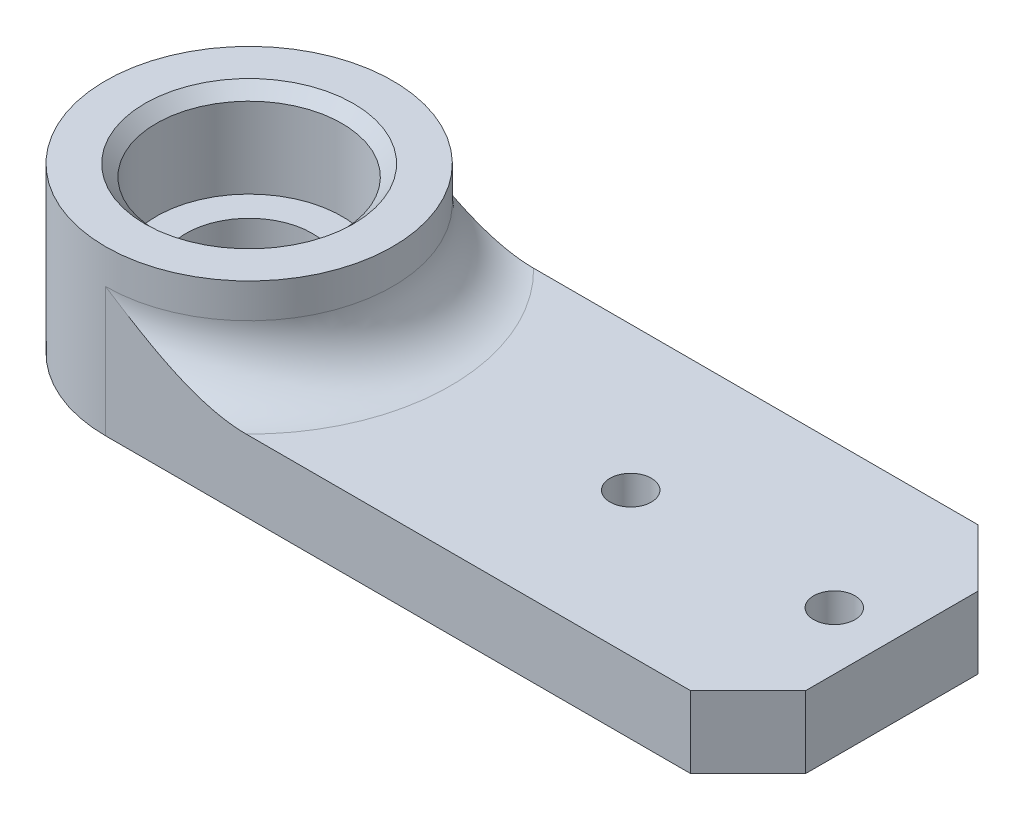
ISO-10303-21;
HEADER;
FILE_DESCRIPTION(('STEP AP214'),'2;1');
FILE_NAME('part.step','',(''),(''),'','','');
FILE_SCHEMA(('AUTOMOTIVE_DESIGN { 1 0 10303 214 1 1 1 1 }'));
ENDSEC;
DATA;
#1=APPLICATION_CONTEXT('core data for automotive mechanical design processes');
#2=APPLICATION_PROTOCOL_DEFINITION('international standard','automotive_design',2000,#1);
#3=PRODUCT_CONTEXT('',#1,'mechanical');
#4=PRODUCT('Part','Part','',(#3));
#5=PRODUCT_RELATED_PRODUCT_CATEGORY('part','',(#4));
#6=PRODUCT_DEFINITION_FORMATION('','',#4);
#7=PRODUCT_DEFINITION_CONTEXT('part definition',#1,'design');
#8=PRODUCT_DEFINITION('design','',#6,#7);
#9=PRODUCT_DEFINITION_SHAPE('','',#8);
#10=(LENGTH_UNIT() NAMED_UNIT(*) SI_UNIT(.MILLI.,.METRE.));
#11=(NAMED_UNIT(*) PLANE_ANGLE_UNIT() SI_UNIT($,.RADIAN.));
#12=(NAMED_UNIT(*) SI_UNIT($,.STERADIAN.) SOLID_ANGLE_UNIT());
#13=UNCERTAINTY_MEASURE_WITH_UNIT(LENGTH_MEASURE(1.E-05),#10,'distance_accuracy_value','');
#14=(GEOMETRIC_REPRESENTATION_CONTEXT(3) GLOBAL_UNCERTAINTY_ASSIGNED_CONTEXT((#13)) GLOBAL_UNIT_ASSIGNED_CONTEXT((#10,
#11,#12)) REPRESENTATION_CONTEXT('',''));
#15=CARTESIAN_POINT('',(0.,0.,0.));
#16=DIRECTION('',(0.,0.,1.));
#17=DIRECTION('',(1.,0.,0.));
#18=AXIS2_PLACEMENT_3D('',#15,#16,#17);
#19=CARTESIAN_POINT('',(0.,4.064,0.));
#20=DIRECTION('',(0.,-1.,0.));
#21=DIRECTION('',(0.,0.,-1.));
#22=AXIS2_PLACEMENT_3D('',#19,#20,#21);
#23=CYLINDRICAL_SURFACE('',#22,6.35);
#24=CARTESIAN_POINT('',(0.,4.064,0.));
#25=DIRECTION('',(0.,1.,0.));
#26=DIRECTION('',(0.,0.,1.));
#27=AXIS2_PLACEMENT_3D('',#24,#25,#26);
#28=CIRCLE('',#27,6.35);
#29=CARTESIAN_POINT('',(0.,4.064,6.35));
#30=VERTEX_POINT('',#29);
#31=EDGE_CURVE('E145',#30,#30,#28,.T.);
#32=ORIENTED_EDGE('',*,*,#31,.F.);
#33=EDGE_LOOP('',(#32));
#34=FACE_BOUND('',#33,.T.);
#35=DIRECTION('',(0.,-1.,0.));
#36=VECTOR('',#35,1.);
#37=CARTESIAN_POINT('',(0.,0.,6.35));
#38=LINE('',#37,#36);
#39=CARTESIAN_POINT('',(0.,2.54,6.35));
#40=VERTEX_POINT('',#39);
#41=CARTESIAN_POINT('',(0.,-3.175,6.35));
#42=VERTEX_POINT('',#41);
#43=EDGE_CURVE('E130',#40,#42,#38,.T.);
#44=ORIENTED_EDGE('',*,*,#43,.F.);
#45=CARTESIAN_POINT('',(0.,2.54,0.));
#46=DIRECTION('',(0.,1.,0.));
#47=DIRECTION('',(0.,0.,1.));
#48=AXIS2_PLACEMENT_3D('',#45,#46,#47);
#49=CIRCLE('',#48,6.35);
#50=CARTESIAN_POINT('',(0.,2.54,-6.35));
#51=VERTEX_POINT('',#50);
#52=EDGE_CURVE('E127',#40,#51,#49,.T.);
#53=ORIENTED_EDGE('',*,*,#52,.T.);
#54=DIRECTION('',(0.,-1.,0.));
#55=VECTOR('',#54,1.);
#56=CARTESIAN_POINT('',(0.,0.,-6.35));
#57=LINE('',#56,#55);
#58=CARTESIAN_POINT('',(0.,-3.175,-6.35));
#59=VERTEX_POINT('',#58);
#60=EDGE_CURVE('E114',#51,#59,#57,.T.);
#61=ORIENTED_EDGE('',*,*,#60,.T.);
#62=CARTESIAN_POINT('',(0.,-3.175,0.));
#63=DIRECTION('',(0.,-1.,0.));
#64=DIRECTION('',(0.,0.,-1.));
#65=AXIS2_PLACEMENT_3D('',#62,#63,#64);
#66=CIRCLE('',#65,6.35);
#67=EDGE_CURVE('E125',#42,#59,#66,.T.);
#68=ORIENTED_EDGE('',*,*,#67,.F.);
#69=EDGE_LOOP('',(#44,#53,#61,#68));
#70=FACE_BOUND('',#69,.T.);
#71=ADVANCED_FACE('F47',(#34,#70),#23,.T.);
#72=CARTESIAN_POINT('',(0.,4.064,0.));
#73=DIRECTION('',(0.,1.,0.));
#74=DIRECTION('',(0.,0.,1.));
#75=AXIS2_PLACEMENT_3D('',#72,#73,#74);
#76=PLANE('',#75);
#77=CARTESIAN_POINT('',(0.,4.064,0.));
#78=DIRECTION('',(0.,1.,0.));
#79=DIRECTION('',(0.,0.,1.));
#80=AXIS2_PLACEMENT_3D('',#77,#78,#79);
#81=CIRCLE('',#80,4.6101);
#82=CARTESIAN_POINT('',(0.,4.064,4.6101));
#83=VERTEX_POINT('',#82);
#84=EDGE_CURVE('E309',#83,#83,#81,.F.);
#85=ORIENTED_EDGE('',*,*,#84,.T.);
#86=EDGE_LOOP('',(#85));
#87=FACE_BOUND('',#86,.T.);
#88=ORIENTED_EDGE('',*,*,#31,.T.);
#89=EDGE_LOOP('',(#88));
#90=FACE_BOUND('',#89,.T.);
#91=ADVANCED_FACE('F210',(#87,#90),#76,.T.);
#92=CARTESIAN_POINT('',(0.,4.064,0.));
#93=DIRECTION('',(0.,-1.,0.));
#94=DIRECTION('',(0.,0.,-1.));
#95=AXIS2_PLACEMENT_3D('',#92,#93,#94);
#96=CYLINDRICAL_SURFACE('',#95,4.1021);
#97=CARTESIAN_POINT('',(0.,3.556,0.));
#98=DIRECTION('',(0.,1.,0.));
#99=DIRECTION('',(0.,0.,1.));
#100=AXIS2_PLACEMENT_3D('',#97,#98,#99);
#101=CIRCLE('',#100,4.1021);
#102=CARTESIAN_POINT('',(0.,3.556,4.1021));
#103=VERTEX_POINT('',#102);
#104=EDGE_CURVE('E321',#103,#103,#101,.T.);
#105=ORIENTED_EDGE('',*,*,#104,.T.);
#106=EDGE_LOOP('',(#105));
#107=FACE_BOUND('',#106,.T.);
#108=CARTESIAN_POINT('',(0.,0.,0.));
#109=DIRECTION('',(0.,1.,0.));
#110=DIRECTION('',(0.,0.,1.));
#111=AXIS2_PLACEMENT_3D('',#108,#109,#110);
#112=CIRCLE('',#111,4.1021);
#113=CARTESIAN_POINT('',(0.,0.,4.1021));
#114=VERTEX_POINT('',#113);
#115=EDGE_CURVE('E139',#114,#114,#112,.T.);
#116=ORIENTED_EDGE('',*,*,#115,.F.);
#117=EDGE_LOOP('',(#116));
#118=FACE_BOUND('',#117,.T.);
#119=ADVANCED_FACE('F216',(#107,#118),#96,.F.);
#120=CARTESIAN_POINT('',(0.,0.,0.));
#121=DIRECTION('',(0.,-1.,0.));
#122=DIRECTION('',(0.,0.,-1.));
#123=AXIS2_PLACEMENT_3D('',#120,#121,#122);
#124=PLANE('',#123);
#125=CARTESIAN_POINT('',(0.,0.,0.));
#126=DIRECTION('',(0.,-1.,0.));
#127=DIRECTION('',(0.,0.,-1.));
#128=AXIS2_PLACEMENT_3D('',#125,#126,#127);
#129=CIRCLE('',#128,2.794);
#130=CARTESIAN_POINT('',(0.,0.,-2.794));
#131=VERTEX_POINT('',#130);
#132=EDGE_CURVE('E148',#131,#131,#129,.T.);
#133=ORIENTED_EDGE('',*,*,#132,.T.);
#134=EDGE_LOOP('',(#133));
#135=FACE_BOUND('',#134,.T.);
#136=ORIENTED_EDGE('',*,*,#115,.T.);
#137=EDGE_LOOP('',(#136));
#138=FACE_BOUND('',#137,.T.);
#139=ADVANCED_FACE('F223',(#135,#138),#124,.F.);
#140=CARTESIAN_POINT('',(0.,-3.175,0.));
#141=DIRECTION('',(0.,-1.,0.));
#142=DIRECTION('',(0.,0.,-1.));
#143=AXIS2_PLACEMENT_3D('',#140,#141,#142);
#144=PLANE('',#143);
#145=DIRECTION('',(0.,0.,-1.));
#146=VECTOR('',#145,1.);
#147=CARTESIAN_POINT('',(28.40228,-3.175,-6.35));
#148=LINE('',#147,#146);
#149=CARTESIAN_POINT('',(28.40228,-3.175,3.81));
#150=VERTEX_POINT('',#149);
#151=CARTESIAN_POINT('',(28.40228,-3.175,-3.80999999999999));
#152=VERTEX_POINT('',#151);
#153=EDGE_CURVE('E121',#150,#152,#148,.T.);
#154=ORIENTED_EDGE('',*,*,#153,.F.);
#155=DIRECTION('',(0.707106781186549,0.,-0.707106781186546));
#156=VECTOR('',#155,1.);
#157=CARTESIAN_POINT('',(16.1061399999999,-3.175,16.10614));
#158=LINE('',#157,#156);
#159=CARTESIAN_POINT('',(25.86228,-3.175,6.35));
#160=VERTEX_POINT('',#159);
#161=EDGE_CURVE('E302',#150,#160,#158,.F.);
#162=ORIENTED_EDGE('',*,*,#161,.T.);
#163=DIRECTION('',(1.,0.,0.));
#164=VECTOR('',#163,1.);
#165=CARTESIAN_POINT('',(28.40228,-3.175,6.35));
#166=LINE('',#165,#164);
#167=EDGE_CURVE('E137',#42,#160,#166,.T.);
#168=ORIENTED_EDGE('',*,*,#167,.F.);
#169=ORIENTED_EDGE('',*,*,#67,.T.);
#170=DIRECTION('',(-1.,0.,0.));
#171=VECTOR('',#170,1.);
#172=CARTESIAN_POINT('',(0.,-3.175,-6.35));
#173=LINE('',#172,#171);
#174=CARTESIAN_POINT('',(25.86228,-3.175,-6.35));
#175=VERTEX_POINT('',#174);
#176=EDGE_CURVE('E110',#175,#59,#173,.T.);
#177=ORIENTED_EDGE('',*,*,#176,.F.);
#178=DIRECTION('',(-0.707106781186546,0.,-0.707106781186549));
#179=VECTOR('',#178,1.);
#180=CARTESIAN_POINT('',(16.10614,-3.175,-16.10614));
#181=LINE('',#180,#179);
#182=EDGE_CURVE('E304',#175,#152,#181,.F.);
#183=ORIENTED_EDGE('',*,*,#182,.T.);
#184=EDGE_LOOP('',(#154,#162,#168,#169,#177,#183));
#185=FACE_BOUND('',#184,.T.);
#186=CARTESIAN_POINT('',(0.,-3.175,0.));
#187=DIRECTION('',(0.,-1.,0.));
#188=DIRECTION('',(0.,0.,-1.));
#189=AXIS2_PLACEMENT_3D('',#186,#187,#188);
#190=CIRCLE('',#189,2.794);
#191=CARTESIAN_POINT('',(0.,-3.175,-2.794));
#192=VERTEX_POINT('',#191);
#193=EDGE_CURVE('E140',#192,#192,#190,.T.);
#194=ORIENTED_EDGE('',*,*,#193,.F.);
#195=EDGE_LOOP('',(#194));
#196=FACE_BOUND('',#195,.T.);
#197=CARTESIAN_POINT('',(25.86228,-3.175,0.));
#198=DIRECTION('',(0.,1.,0.));
#199=DIRECTION('',(0.,0.,1.));
#200=AXIS2_PLACEMENT_3D('',#197,#198,#199);
#201=CIRCLE('',#200,0.914399999999999);
#202=CARTESIAN_POINT('',(25.86228,-3.175,0.914399999999999));
#203=VERTEX_POINT('',#202);
#204=EDGE_CURVE('E263',#203,#203,#201,.T.);
#205=ORIENTED_EDGE('',*,*,#204,.T.);
#206=EDGE_LOOP('',(#205));
#207=FACE_BOUND('',#206,.T.);
#208=CARTESIAN_POINT('',(16.86306,-3.175,0.));
#209=DIRECTION('',(0.,1.,0.));
#210=DIRECTION('',(0.,0.,1.));
#211=AXIS2_PLACEMENT_3D('',#208,#209,#210);
#212=CIRCLE('',#211,0.914399999999999);
#213=CARTESIAN_POINT('',(16.86306,-3.175,0.914399999999999));
#214=VERTEX_POINT('',#213);
#215=EDGE_CURVE('E271',#214,#214,#212,.T.);
#216=ORIENTED_EDGE('',*,*,#215,.T.);
#217=EDGE_LOOP('',(#216));
#218=FACE_BOUND('',#217,.T.);
#219=ADVANCED_FACE('F135',(#185,#196,#207,#218),#144,.T.);
#220=CARTESIAN_POINT('',(0.,-3.175,0.));
#221=DIRECTION('',(0.,1.,0.));
#222=DIRECTION('',(0.,0.,1.));
#223=AXIS2_PLACEMENT_3D('',#220,#221,#222);
#224=CYLINDRICAL_SURFACE('',#223,2.794);
#225=ORIENTED_EDGE('',*,*,#193,.T.);
#226=EDGE_LOOP('',(#225));
#227=FACE_BOUND('',#226,.T.);
#228=ORIENTED_EDGE('',*,*,#132,.F.);
#229=EDGE_LOOP('',(#228));
#230=FACE_BOUND('',#229,.T.);
#231=ADVANCED_FACE('F232',(#227,#230),#224,.F.);
#232=CARTESIAN_POINT('',(0.,0.,0.));
#233=DIRECTION('',(0.,1.,0.));
#234=DIRECTION('',(0.,0.,1.));
#235=AXIS2_PLACEMENT_3D('',#232,#233,#234);
#236=PLANE('',#235);
#237=CARTESIAN_POINT('',(25.86228,0.,0.));
#238=DIRECTION('',(0.,1.,0.));
#239=DIRECTION('',(0.,0.,1.));
#240=AXIS2_PLACEMENT_3D('',#237,#238,#239);
#241=CIRCLE('',#240,0.914399999999999);
#242=CARTESIAN_POINT('',(25.86228,0.,0.914399999999999));
#243=VERTEX_POINT('',#242);
#244=EDGE_CURVE('E255',#243,#243,#241,.T.);
#245=ORIENTED_EDGE('',*,*,#244,.F.);
#246=EDGE_LOOP('',(#245));
#247=FACE_BOUND('',#246,.T.);
#248=DIRECTION('',(1.,0.,0.));
#249=VECTOR('',#248,1.);
#250=CARTESIAN_POINT('',(28.40228,0.,6.35));
#251=LINE('',#250,#249);
#252=CARTESIAN_POINT('',(6.22170394666928,0.,6.35));
#253=VERTEX_POINT('',#252);
#254=CARTESIAN_POINT('',(25.86228,0.,6.35));
#255=VERTEX_POINT('',#254);
#256=EDGE_CURVE('E120',#253,#255,#251,.T.);
#257=ORIENTED_EDGE('',*,*,#256,.T.);
#258=DIRECTION('',(-0.707106781186549,0.,0.707106781186546));
#259=VECTOR('',#258,1.);
#260=CARTESIAN_POINT('',(16.1061399999999,0.,16.10614));
#261=LINE('',#260,#259);
#262=CARTESIAN_POINT('',(28.40228,0.,3.81));
#263=VERTEX_POINT('',#262);
#264=EDGE_CURVE('E57',#255,#263,#261,.F.);
#265=ORIENTED_EDGE('',*,*,#264,.T.);
#266=DIRECTION('',(0.,0.,-1.));
#267=VECTOR('',#266,1.);
#268=CARTESIAN_POINT('',(28.40228,0.,-6.35));
#269=LINE('',#268,#267);
#270=CARTESIAN_POINT('',(28.40228,0.,-3.80999999999999));
#271=VERTEX_POINT('',#270);
#272=EDGE_CURVE('E258',#263,#271,#269,.T.);
#273=ORIENTED_EDGE('',*,*,#272,.T.);
#274=DIRECTION('',(0.707106781186546,0.,0.707106781186549));
#275=VECTOR('',#274,1.);
#276=CARTESIAN_POINT('',(16.10614,0.,-16.10614));
#277=LINE('',#276,#275);
#278=CARTESIAN_POINT('',(25.86228,0.,-6.35));
#279=VERTEX_POINT('',#278);
#280=EDGE_CURVE('E64',#271,#279,#277,.F.);
#281=ORIENTED_EDGE('',*,*,#280,.T.);
#282=DIRECTION('',(-1.,0.,0.));
#283=VECTOR('',#282,1.);
#284=CARTESIAN_POINT('',(0.,0.,-6.35));
#285=LINE('',#284,#283);
#286=CARTESIAN_POINT('',(6.22170394666927,0.,-6.35));
#287=VERTEX_POINT('',#286);
#288=EDGE_CURVE('E131',#279,#287,#285,.T.);
#289=ORIENTED_EDGE('',*,*,#288,.T.);
#290=CARTESIAN_POINT('',(0.,0.,0.));
#291=DIRECTION('',(0.,1.,0.));
#292=DIRECTION('',(0.,0.,1.));
#293=AXIS2_PLACEMENT_3D('',#290,#291,#292);
#294=CIRCLE('',#293,8.89);
#295=EDGE_CURVE('E155',#287,#253,#294,.F.);
#296=ORIENTED_EDGE('',*,*,#295,.T.);
#297=EDGE_LOOP('',(#257,#265,#273,#281,#289,#296));
#298=FACE_BOUND('',#297,.T.);
#299=CARTESIAN_POINT('',(16.86306,0.,0.));
#300=DIRECTION('',(0.,1.,0.));
#301=DIRECTION('',(0.,0.,1.));
#302=AXIS2_PLACEMENT_3D('',#299,#300,#301);
#303=CIRCLE('',#302,0.914399999999999);
#304=CARTESIAN_POINT('',(16.86306,0.,0.914399999999999));
#305=VERTEX_POINT('',#304);
#306=EDGE_CURVE('E267',#305,#305,#303,.T.);
#307=ORIENTED_EDGE('',*,*,#306,.F.);
#308=EDGE_LOOP('',(#307));
#309=FACE_BOUND('',#308,.T.);
#310=ADVANCED_FACE('F234',(#247,#298,#309),#236,.T.);
#311=CARTESIAN_POINT('',(28.40228,0.,6.35));
#312=DIRECTION('',(0.,0.,-1.));
#313=DIRECTION('',(-1.,0.,0.));
#314=AXIS2_PLACEMENT_3D('',#311,#312,#313);
#315=PLANE('',#314);
#316=ORIENTED_EDGE('',*,*,#167,.T.);
#317=DIRECTION('',(0.,1.,0.));
#318=VECTOR('',#317,1.);
#319=CARTESIAN_POINT('',(25.86228,0.,6.35));
#320=LINE('',#319,#318);
#321=EDGE_CURVE('E72',#160,#255,#320,.T.);
#322=ORIENTED_EDGE('',*,*,#321,.T.);
#323=ORIENTED_EDGE('',*,*,#256,.F.);
#324=CARTESIAN_POINT('',(6.22170394666927,0.,6.35));
#325=CARTESIAN_POINT('',(6.05009662465933,3.08818698320631E-05,6.35));
#326=CARTESIAN_POINT('',(5.8787220171483,0.00851038604492448,6.35));
#327=CARTESIAN_POINT('',(5.53769158273662,0.0403650460504789,6.35));
#328=CARTESIAN_POINT('',(5.3680329417888,0.0637094719432283,6.35));
#329=CARTESIAN_POINT('',(4.8679412933859,0.152136257270664,6.35));
#330=CARTESIAN_POINT('',(4.54074842905239,0.23574879539358,6.35));
#331=CARTESIAN_POINT('',(4.03180053733557,0.397651159888791,6.35));
#332=CARTESIAN_POINT('',(3.84590559964747,0.463817908061009,6.35));
#333=CARTESIAN_POINT('',(3.47820615184848,0.606740689981162,6.35));
#334=CARTESIAN_POINT('',(3.29640172172806,0.683496930599227,6.35));
#335=CARTESIAN_POINT('',(2.75642243342903,0.926883521225198,6.35));
#336=CARTESIAN_POINT('',(2.40413309567856,1.1064781918716,6.35));
#337=CARTESIAN_POINT('',(1.70886760311351,1.4883091609906,6.35));
#338=CARTESIAN_POINT('',(1.36598603601184,1.69071182225457,6.35));
#339=CARTESIAN_POINT('',(0.686540816101278,2.10588342390928,6.35));
#340=CARTESIAN_POINT('',(0.349978870291561,2.31865511083843,6.35));
#341=CARTESIAN_POINT('',(0.00897969308627192,2.53432074463459,6.35));
#342=CARTESIAN_POINT('',(0.00448984560380131,2.53716037354307,6.35));
#343=CARTESIAN_POINT('',(0.,2.54,6.35));
#344=B_SPLINE_CURVE_WITH_KNOTS('',3,(#324,#325,#326,#327,#328,#329,#330,#331,#332,#333,#334,
#335,#336,#337,#338,#339,#340,#341,#342,#343),.UNSPECIFIED.,.F.,.F.,(4,2,2,2,2,2,2,2,2,4),(0.,
0.514254767378665,1.02744986299136,2.03709782488109,2.62881747403445,3.22054868431393,
4.40543471662092,5.59960376063116,6.79409085280885,6.81002823025942),.UNSPECIFIED.);
#345=EDGE_CURVE('E161',#253,#40,#344,.T.);
#346=ORIENTED_EDGE('',*,*,#345,.T.);
#347=ORIENTED_EDGE('',*,*,#43,.T.);
#348=EDGE_LOOP('',(#316,#322,#323,#346,#347));
#349=FACE_BOUND('',#348,.T.);
#350=ADVANCED_FACE('F178',(#349),#315,.F.);
#351=CARTESIAN_POINT('',(28.40228,0.,-6.35));
#352=DIRECTION('',(-1.,0.,0.));
#353=DIRECTION('',(0.,0.,1.));
#354=AXIS2_PLACEMENT_3D('',#351,#352,#353);
#355=PLANE('',#354);
#356=ORIENTED_EDGE('',*,*,#272,.F.);
#357=DIRECTION('',(0.,-1.,0.));
#358=VECTOR('',#357,1.);
#359=CARTESIAN_POINT('',(28.40228,0.,3.81));
#360=LINE('',#359,#358);
#361=EDGE_CURVE('E299',#263,#150,#360,.T.);
#362=ORIENTED_EDGE('',*,*,#361,.T.);
#363=ORIENTED_EDGE('',*,*,#153,.T.);
#364=DIRECTION('',(0.,1.,0.));
#365=VECTOR('',#364,1.);
#366=CARTESIAN_POINT('',(28.40228,0.,-3.80999999999999));
#367=LINE('',#366,#365);
#368=EDGE_CURVE('E301',#152,#271,#367,.T.);
#369=ORIENTED_EDGE('',*,*,#368,.T.);
#370=EDGE_LOOP('',(#356,#362,#363,#369));
#371=FACE_BOUND('',#370,.T.);
#372=ADVANCED_FACE('F290',(#371),#355,.F.);
#373=CARTESIAN_POINT('',(0.,0.,-6.35));
#374=DIRECTION('',(0.,0.,1.));
#375=DIRECTION('',(1.,0.,0.));
#376=AXIS2_PLACEMENT_3D('',#373,#374,#375);
#377=PLANE('',#376);
#378=ORIENTED_EDGE('',*,*,#288,.F.);
#379=DIRECTION('',(0.,-1.,0.));
#380=VECTOR('',#379,1.);
#381=CARTESIAN_POINT('',(25.86228,0.,-6.35));
#382=LINE('',#381,#380);
#383=EDGE_CURVE('E11',#279,#175,#382,.T.);
#384=ORIENTED_EDGE('',*,*,#383,.T.);
#385=ORIENTED_EDGE('',*,*,#176,.T.);
#386=ORIENTED_EDGE('',*,*,#60,.F.);
#387=CARTESIAN_POINT('',(6.22170394666927,0.,-6.35));
#388=CARTESIAN_POINT('',(6.05009662465934,3.08818698322183E-05,-6.35));
#389=CARTESIAN_POINT('',(5.87872201714832,0.00851038604492358,-6.35));
#390=CARTESIAN_POINT('',(5.53769158273666,0.0403650460504743,-6.35));
#391=CARTESIAN_POINT('',(5.36803294178885,0.0637094719432212,-6.35));
#392=CARTESIAN_POINT('',(4.86794129338593,0.152136257270654,-6.35));
#393=CARTESIAN_POINT('',(4.54074842905241,0.235748795393574,-6.35));
#394=CARTESIAN_POINT('',(4.03180053733557,0.397651159888791,-6.35));
#395=CARTESIAN_POINT('',(3.84590559964747,0.46381790806101,-6.35));
#396=CARTESIAN_POINT('',(3.47820615184847,0.606740689981165,-6.35));
#397=CARTESIAN_POINT('',(3.29640172172806,0.683496930599232,-6.35));
#398=CARTESIAN_POINT('',(2.75642243342901,0.926883521225202,-6.35));
#399=CARTESIAN_POINT('',(2.40413309567852,1.10647819187159,-6.35));
#400=CARTESIAN_POINT('',(1.7088676031135,1.48830916099064,-6.35));
#401=CARTESIAN_POINT('',(1.36598603601187,1.69071182225465,-6.35));
#402=CARTESIAN_POINT('',(0.68654081610122,2.10588342390922,-6.35));
#403=CARTESIAN_POINT('',(0.349978870291383,2.31865511083816,-6.35));
#404=CARTESIAN_POINT('',(0.00897969308626838,2.53432074463458,-6.35));
#405=CARTESIAN_POINT('',(0.00448984560379951,2.53716037354307,-6.35));
#406=CARTESIAN_POINT('',(0.,2.54,-6.35));
#407=B_SPLINE_CURVE_WITH_KNOTS('',3,(#387,#388,#389,#390,#391,#392,#393,#394,#395,#396,#397,
#398,#399,#400,#401,#402,#403,#404,#405,#406),.UNSPECIFIED.,.F.,.F.,(4,2,2,2,2,2,2,2,2,4),(0.,
0.514254767378636,1.02744986299131,2.03709782488109,2.62881747403446,3.22054868431394,
4.40543471662096,5.59960376063119,6.79409085280885,6.81002823025942),.UNSPECIFIED.);
#408=EDGE_CURVE('E171',#51,#287,#407,.F.);
#409=ORIENTED_EDGE('',*,*,#408,.T.);
#410=EDGE_LOOP('',(#378,#384,#385,#386,#409));
#411=FACE_BOUND('',#410,.T.);
#412=ADVANCED_FACE('F112',(#411),#377,.F.);
#413=CARTESIAN_POINT('',(25.86228,0.,0.));
#414=DIRECTION('',(0.,-1.,0.));
#415=DIRECTION('',(0.,0.,-1.));
#416=AXIS2_PLACEMENT_3D('',#413,#414,#415);
#417=CYLINDRICAL_SURFACE('',#416,0.914399999999999);
#418=ORIENTED_EDGE('',*,*,#244,.T.);
#419=EDGE_LOOP('',(#418));
#420=FACE_BOUND('',#419,.T.);
#421=ORIENTED_EDGE('',*,*,#204,.F.);
#422=EDGE_LOOP('',(#421));
#423=FACE_BOUND('',#422,.T.);
#424=ADVANCED_FACE('F281',(#420,#423),#417,.F.);
#425=CARTESIAN_POINT('',(16.86306,0.,0.));
#426=DIRECTION('',(0.,-1.,0.));
#427=DIRECTION('',(0.,0.,-1.));
#428=AXIS2_PLACEMENT_3D('',#425,#426,#427);
#429=CYLINDRICAL_SURFACE('',#428,0.914399999999999);
#430=ORIENTED_EDGE('',*,*,#306,.T.);
#431=EDGE_LOOP('',(#430));
#432=FACE_BOUND('',#431,.T.);
#433=ORIENTED_EDGE('',*,*,#215,.F.);
#434=EDGE_LOOP('',(#433));
#435=FACE_BOUND('',#434,.T.);
#436=ADVANCED_FACE('F188',(#432,#435),#429,.F.);
#437=CARTESIAN_POINT('',(0.,2.54,0.));
#438=DIRECTION('',(0.,1.,0.));
#439=DIRECTION('',(0.,0.,1.));
#440=AXIS2_PLACEMENT_3D('',#437,#438,#439);
#441=TOROIDAL_SURFACE('',#440,8.89,2.54);
#442=ORIENTED_EDGE('',*,*,#408,.F.);
#443=ORIENTED_EDGE('',*,*,#52,.F.);
#444=ORIENTED_EDGE('',*,*,#345,.F.);
#445=ORIENTED_EDGE('',*,*,#295,.F.);
#446=EDGE_LOOP('',(#442,#443,#444,#445));
#447=FACE_BOUND('',#446,.T.);
#448=ADVANCED_FACE('F182',(#447),#441,.F.);
#449=CARTESIAN_POINT('',(0.,3.556,0.));
#450=DIRECTION('',(0.,1.,0.));
#451=DIRECTION('',(0.,0.,1.));
#452=AXIS2_PLACEMENT_3D('',#449,#450,#451);
#453=CONICAL_SURFACE('',#452,4.1021,0.785398163397452);
#454=ORIENTED_EDGE('',*,*,#84,.F.);
#455=EDGE_LOOP('',(#454));
#456=FACE_BOUND('',#455,.T.);
#457=ORIENTED_EDGE('',*,*,#104,.F.);
#458=EDGE_LOOP('',(#457));
#459=FACE_BOUND('',#458,.T.);
#460=ADVANCED_FACE('F187',(#456,#459),#453,.F.);
#461=CARTESIAN_POINT('',(28.40228,0.,3.81));
#462=DIRECTION('',(-0.707106781186546,0.,-0.707106781186549));
#463=DIRECTION('',(0.,-1.,0.));
#464=AXIS2_PLACEMENT_3D('',#461,#462,#463);
#465=PLANE('',#464);
#466=ORIENTED_EDGE('',*,*,#264,.F.);
#467=ORIENTED_EDGE('',*,*,#321,.F.);
#468=ORIENTED_EDGE('',*,*,#161,.F.);
#469=ORIENTED_EDGE('',*,*,#361,.F.);
#470=EDGE_LOOP('',(#466,#467,#468,#469));
#471=FACE_BOUND('',#470,.T.);
#472=ADVANCED_FACE('F197',(#471),#465,.F.);
#473=CARTESIAN_POINT('',(25.86228,0.,-6.35));
#474=DIRECTION('',(-0.707106781186549,0.,0.707106781186546));
#475=DIRECTION('',(0.,-1.,0.));
#476=AXIS2_PLACEMENT_3D('',#473,#474,#475);
#477=PLANE('',#476);
#478=ORIENTED_EDGE('',*,*,#280,.F.);
#479=ORIENTED_EDGE('',*,*,#368,.F.);
#480=ORIENTED_EDGE('',*,*,#182,.F.);
#481=ORIENTED_EDGE('',*,*,#383,.F.);
#482=EDGE_LOOP('',(#478,#479,#480,#481));
#483=FACE_BOUND('',#482,.T.);
#484=ADVANCED_FACE('F50',(#483),#477,.F.);
#485=CLOSED_SHELL('',(#71,#91,#119,#139,#219,#231,#310,#350,#372,#412,#424,#436,#448,#460,#472,#484));
#486=MANIFOLD_SOLID_BREP('B2',#485);
#487=ADVANCED_BREP_SHAPE_REPRESENTATION('',(#18,#486),#14);
#488=SHAPE_DEFINITION_REPRESENTATION(#9,#487);
ENDSEC;
END-ISO-10303-21;
